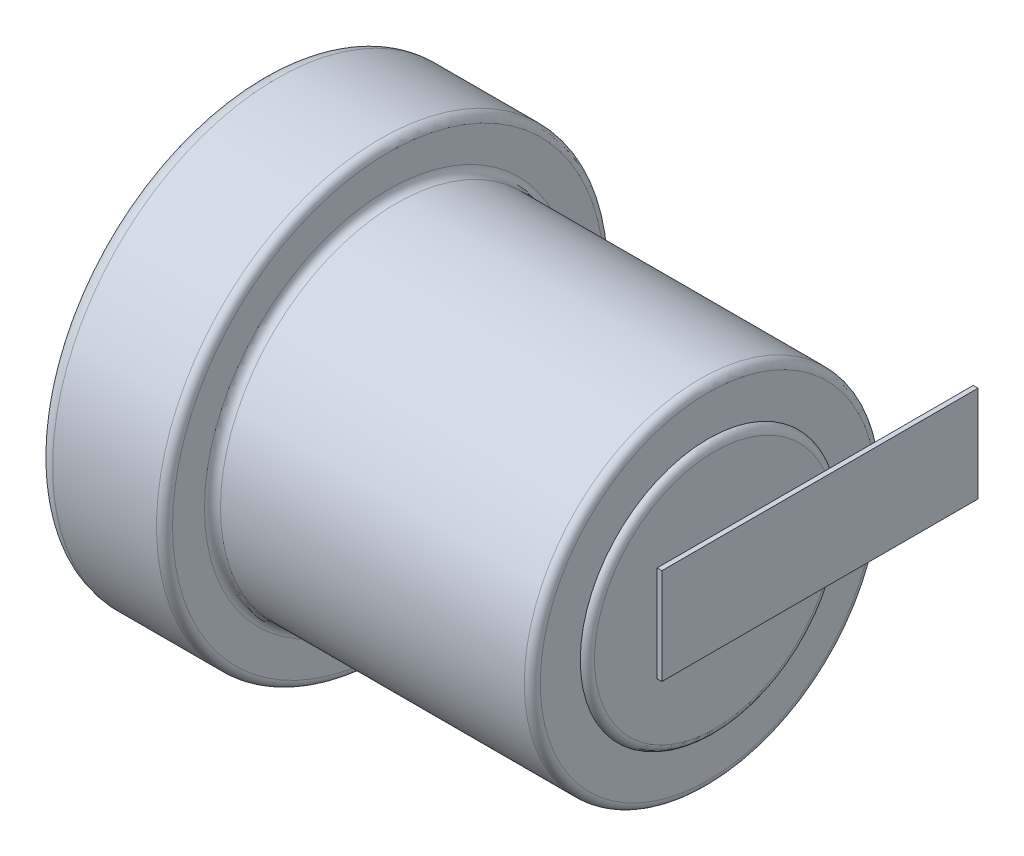
ISO-10303-21;
HEADER;
FILE_DESCRIPTION(('STEP AP214'),'2;1');
FILE_NAME('part.step','',(''),(''),'','','');
FILE_SCHEMA(('AUTOMOTIVE_DESIGN { 1 0 10303 214 1 1 1 1 }'));
ENDSEC;
DATA;
#1=APPLICATION_CONTEXT('core data for automotive mechanical design processes');
#2=APPLICATION_PROTOCOL_DEFINITION('international standard','automotive_design',2000,#1);
#3=PRODUCT_CONTEXT('',#1,'mechanical');
#4=PRODUCT('Part','Part','',(#3));
#5=PRODUCT_RELATED_PRODUCT_CATEGORY('part','',(#4));
#6=PRODUCT_DEFINITION_FORMATION('','',#4);
#7=PRODUCT_DEFINITION_CONTEXT('part definition',#1,'design');
#8=PRODUCT_DEFINITION('design','',#6,#7);
#9=PRODUCT_DEFINITION_SHAPE('','',#8);
#10=(LENGTH_UNIT() NAMED_UNIT(*) SI_UNIT(.MILLI.,.METRE.));
#11=(NAMED_UNIT(*) PLANE_ANGLE_UNIT() SI_UNIT($,.RADIAN.));
#12=(NAMED_UNIT(*) SI_UNIT($,.STERADIAN.) SOLID_ANGLE_UNIT());
#13=UNCERTAINTY_MEASURE_WITH_UNIT(LENGTH_MEASURE(1.E-05),#10,'distance_accuracy_value','');
#14=(GEOMETRIC_REPRESENTATION_CONTEXT(3) GLOBAL_UNCERTAINTY_ASSIGNED_CONTEXT((#13)) GLOBAL_UNIT_ASSIGNED_CONTEXT((#10,
#11,#12)) REPRESENTATION_CONTEXT('',''));
#15=CARTESIAN_POINT('',(0.,0.,0.));
#16=DIRECTION('',(0.,0.,1.));
#17=DIRECTION('',(1.,0.,0.));
#18=AXIS2_PLACEMENT_3D('',#15,#16,#17);
#19=CARTESIAN_POINT('',(14.2,0.,7.));
#20=DIRECTION('',(1.,0.,0.));
#21=DIRECTION('',(0.,0.,-1.));
#22=AXIS2_PLACEMENT_3D('',#19,#20,#21);
#23=PLANE('',#22);
#24=DIRECTION('',(0.,0.,-1.));
#25=VECTOR('',#24,1.);
#26=CARTESIAN_POINT('',(14.2,1.5,8.8));
#27=LINE('',#26,#25);
#28=CARTESIAN_POINT('',(14.2,1.5,8.8));
#29=VERTEX_POINT('',#28);
#30=CARTESIAN_POINT('',(14.2,1.5,3.55755781373551));
#31=VERTEX_POINT('',#30);
#32=EDGE_CURVE('E75',#29,#31,#27,.T.);
#33=ORIENTED_EDGE('',*,*,#32,.T.);
#34=CARTESIAN_POINT('',(14.2,0.,7.));
#35=DIRECTION('',(1.,0.,0.));
#36=DIRECTION('',(0.,0.,-1.));
#37=AXIS2_PLACEMENT_3D('',#34,#35,#36);
#38=CIRCLE('',#37,3.75505102572168);
#39=CARTESIAN_POINT('',(14.2,-1.5,3.55755781373551));
#40=VERTEX_POINT('',#39);
#41=EDGE_CURVE('E371',#31,#40,#38,.T.);
#42=ORIENTED_EDGE('',*,*,#41,.T.);
#43=DIRECTION('',(0.,0.,1.));
#44=VECTOR('',#43,1.);
#45=CARTESIAN_POINT('',(14.2,-1.5,7.));
#46=LINE('',#45,#44);
#47=CARTESIAN_POINT('',(14.2,-1.5,8.8));
#48=VERTEX_POINT('',#47);
#49=EDGE_CURVE('E67',#40,#48,#46,.T.);
#50=ORIENTED_EDGE('',*,*,#49,.T.);
#51=DIRECTION('',(0.,1.,0.));
#52=VECTOR('',#51,1.);
#53=CARTESIAN_POINT('',(14.2,-1.5,8.8));
#54=LINE('',#53,#52);
#55=EDGE_CURVE('E210',#48,#29,#54,.T.);
#56=ORIENTED_EDGE('',*,*,#55,.T.);
#57=EDGE_LOOP('',(#33,#42,#50,#56));
#58=FACE_BOUND('',#57,.T.);
#59=ADVANCED_FACE('F51',(#58),#23,.T.);
#60=CARTESIAN_POINT('',(-0.4,0.,7.));
#61=DIRECTION('',(-1.,0.,0.));
#62=DIRECTION('',(0.,0.,1.));
#63=AXIS2_PLACEMENT_3D('',#60,#61,#62);
#64=PLANE('',#63);
#65=CARTESIAN_POINT('',(-0.4,0.,7.));
#66=DIRECTION('',(-1.,0.,0.));
#67=DIRECTION('',(0.,0.,1.));
#68=AXIS2_PLACEMENT_3D('',#65,#66,#67);
#69=CIRCLE('',#68,3.);
#70=CARTESIAN_POINT('',(-0.4,0.,10.));
#71=VERTEX_POINT('',#70);
#72=EDGE_CURVE('E363',#71,#71,#69,.T.);
#73=ORIENTED_EDGE('',*,*,#72,.T.);
#74=EDGE_LOOP('',(#73));
#75=FACE_BOUND('',#74,.T.);
#76=DIRECTION('',(0.,1.,0.));
#77=VECTOR('',#76,1.);
#78=CARTESIAN_POINT('',(-0.4,-1.5,8.8));
#79=LINE('',#78,#77);
#80=CARTESIAN_POINT('',(-0.4,-1.5,8.8));
#81=VERTEX_POINT('',#80);
#82=CARTESIAN_POINT('',(-0.4,1.5,8.8));
#83=VERTEX_POINT('',#82);
#84=EDGE_CURVE('E307',#81,#83,#79,.T.);
#85=ORIENTED_EDGE('',*,*,#84,.F.);
#86=DIRECTION('',(0.,0.,1.));
#87=VECTOR('',#86,1.);
#88=CARTESIAN_POINT('',(-0.4,-1.5,7.));
#89=LINE('',#88,#87);
#90=CARTESIAN_POINT('',(-0.4,-1.5,5.2));
#91=VERTEX_POINT('',#90);
#92=EDGE_CURVE('E288',#91,#81,#89,.T.);
#93=ORIENTED_EDGE('',*,*,#92,.F.);
#94=DIRECTION('',(0.,-1.,0.));
#95=VECTOR('',#94,1.);
#96=CARTESIAN_POINT('',(-0.4,1.5,5.2));
#97=LINE('',#96,#95);
#98=CARTESIAN_POINT('',(-0.4,1.5,5.2));
#99=VERTEX_POINT('',#98);
#100=EDGE_CURVE('E293',#99,#91,#97,.T.);
#101=ORIENTED_EDGE('',*,*,#100,.F.);
#102=DIRECTION('',(0.,0.,-1.));
#103=VECTOR('',#102,1.);
#104=CARTESIAN_POINT('',(-0.4,1.5,8.8));
#105=LINE('',#104,#103);
#106=EDGE_CURVE('E310',#83,#99,#105,.T.);
#107=ORIENTED_EDGE('',*,*,#106,.F.);
#108=EDGE_LOOP('',(#85,#93,#101,#107));
#109=FACE_BOUND('',#108,.T.);
#110=ADVANCED_FACE('F395',(#75,#109),#64,.T.);
#111=CARTESIAN_POINT('',(4.,0.,7.));
#112=DIRECTION('',(-1.,0.,0.));
#113=DIRECTION('',(0.,0.,1.));
#114=AXIS2_PLACEMENT_3D('',#111,#112,#113);
#115=CYLINDRICAL_SURFACE('',#114,7.);
#116=CARTESIAN_POINT('',(0.5,0.,7.));
#117=DIRECTION('',(1.,0.,0.));
#118=DIRECTION('',(0.,0.,-1.));
#119=AXIS2_PLACEMENT_3D('',#116,#117,#118);
#120=CIRCLE('',#119,7.);
#121=CARTESIAN_POINT('',(0.5,0.,0.));
#122=VERTEX_POINT('',#121);
#123=EDGE_CURVE('E355',#122,#122,#120,.T.);
#124=ORIENTED_EDGE('',*,*,#123,.T.);
#125=EDGE_LOOP('',(#124));
#126=FACE_BOUND('',#125,.T.);
#127=CARTESIAN_POINT('',(3.75,0.,7.));
#128=DIRECTION('',(1.,0.,0.));
#129=DIRECTION('',(0.,0.,-1.));
#130=AXIS2_PLACEMENT_3D('',#127,#128,#129);
#131=CIRCLE('',#130,7.);
#132=CARTESIAN_POINT('',(3.75,0.,0.));
#133=VERTEX_POINT('',#132);
#134=EDGE_CURVE('E351',#133,#133,#131,.F.);
#135=ORIENTED_EDGE('',*,*,#134,.T.);
#136=EDGE_LOOP('',(#135));
#137=FACE_BOUND('',#136,.T.);
#138=ADVANCED_FACE('F400',(#126,#137),#115,.T.);
#139=CARTESIAN_POINT('',(4.,0.,0.));
#140=DIRECTION('',(1.,0.,0.));
#141=DIRECTION('',(0.,0.,-1.));
#142=AXIS2_PLACEMENT_3D('',#139,#140,#141);
#143=PLANE('',#142);
#144=CARTESIAN_POINT('',(4.,0.,7.));
#145=DIRECTION('',(1.,0.,0.));
#146=DIRECTION('',(0.,0.,-1.));
#147=AXIS2_PLACEMENT_3D('',#144,#145,#146);
#148=CIRCLE('',#147,6.75);
#149=CARTESIAN_POINT('',(4.,0.,0.25));
#150=VERTEX_POINT('',#149);
#151=EDGE_CURVE('E347',#150,#150,#148,.T.);
#152=ORIENTED_EDGE('',*,*,#151,.T.);
#153=EDGE_LOOP('',(#152));
#154=FACE_BOUND('',#153,.T.);
#155=CARTESIAN_POINT('',(4.,0.,7.));
#156=DIRECTION('',(1.,0.,0.));
#157=DIRECTION('',(0.,0.,-1.));
#158=AXIS2_PLACEMENT_3D('',#155,#156,#157);
#159=CIRCLE('',#158,5.75);
#160=CARTESIAN_POINT('',(4.,0.,1.25));
#161=VERTEX_POINT('',#160);
#162=EDGE_CURVE('E343',#161,#161,#159,.F.);
#163=ORIENTED_EDGE('',*,*,#162,.T.);
#164=EDGE_LOOP('',(#163));
#165=FACE_BOUND('',#164,.T.);
#166=ADVANCED_FACE('F414',(#154,#165),#143,.T.);
#167=CARTESIAN_POINT('',(0.,0.,0.));
#168=DIRECTION('',(1.,0.,0.));
#169=DIRECTION('',(0.,0.,-1.));
#170=AXIS2_PLACEMENT_3D('',#167,#168,#169);
#171=PLANE('',#170);
#172=CARTESIAN_POINT('',(0.,0.,7.));
#173=DIRECTION('',(1.,0.,0.));
#174=DIRECTION('',(0.,0.,-1.));
#175=AXIS2_PLACEMENT_3D('',#172,#173,#174);
#176=CIRCLE('',#175,6.5);
#177=CARTESIAN_POINT('',(0.,0.,0.5));
#178=VERTEX_POINT('',#177);
#179=EDGE_CURVE('E359',#178,#178,#176,.F.);
#180=ORIENTED_EDGE('',*,*,#179,.T.);
#181=EDGE_LOOP('',(#180));
#182=FACE_BOUND('',#181,.T.);
#183=CARTESIAN_POINT('',(0.,0.,7.));
#184=DIRECTION('',(-1.,0.,0.));
#185=DIRECTION('',(0.,0.,1.));
#186=AXIS2_PLACEMENT_3D('',#183,#184,#185);
#187=CIRCLE('',#186,5.);
#188=CARTESIAN_POINT('',(0.,0.,12.));
#189=VERTEX_POINT('',#188);
#190=EDGE_CURVE('E327',#189,#189,#187,.T.);
#191=ORIENTED_EDGE('',*,*,#190,.F.);
#192=EDGE_LOOP('',(#191));
#193=FACE_BOUND('',#192,.T.);
#194=ADVANCED_FACE('F412',(#182,#193),#171,.F.);
#195=CARTESIAN_POINT('',(14.,0.,7.));
#196=DIRECTION('',(-1.,0.,0.));
#197=DIRECTION('',(0.,0.,1.));
#198=AXIS2_PLACEMENT_3D('',#195,#196,#197);
#199=CYLINDRICAL_SURFACE('',#198,5.5);
#200=CARTESIAN_POINT('',(13.75,0.,7.));
#201=DIRECTION('',(1.,0.,0.));
#202=DIRECTION('',(0.,0.,-1.));
#203=AXIS2_PLACEMENT_3D('',#200,#201,#202);
#204=CIRCLE('',#203,5.5);
#205=CARTESIAN_POINT('',(13.75,0.,1.5));
#206=VERTEX_POINT('',#205);
#207=EDGE_CURVE('E12',#206,#206,#204,.F.);
#208=ORIENTED_EDGE('',*,*,#207,.T.);
#209=EDGE_LOOP('',(#208));
#210=FACE_BOUND('',#209,.T.);
#211=CARTESIAN_POINT('',(4.25,0.,7.));
#212=DIRECTION('',(1.,0.,0.));
#213=DIRECTION('',(0.,0.,-1.));
#214=AXIS2_PLACEMENT_3D('',#211,#212,#213);
#215=CIRCLE('',#214,5.5);
#216=CARTESIAN_POINT('',(4.25,0.,1.5));
#217=VERTEX_POINT('',#216);
#218=EDGE_CURVE('E339',#217,#217,#215,.T.);
#219=ORIENTED_EDGE('',*,*,#218,.T.);
#220=EDGE_LOOP('',(#219));
#221=FACE_BOUND('',#220,.T.);
#222=ADVANCED_FACE('F409',(#210,#221),#199,.T.);
#223=CARTESIAN_POINT('',(14.,0.,7.));
#224=DIRECTION('',(1.,0.,0.));
#225=DIRECTION('',(0.,0.,-1.));
#226=AXIS2_PLACEMENT_3D('',#223,#224,#225);
#227=PLANE('',#226);
#228=CARTESIAN_POINT('',(14.,0.,7.));
#229=DIRECTION('',(1.,0.,0.));
#230=DIRECTION('',(0.,0.,-1.));
#231=AXIS2_PLACEMENT_3D('',#228,#229,#230);
#232=CIRCLE('',#231,5.25);
#233=CARTESIAN_POINT('',(14.,0.,1.75));
#234=VERTEX_POINT('',#233);
#235=EDGE_CURVE('E60',#234,#234,#232,.T.);
#236=ORIENTED_EDGE('',*,*,#235,.T.);
#237=EDGE_LOOP('',(#236));
#238=FACE_BOUND('',#237,.T.);
#239=CARTESIAN_POINT('',(14.,0.,7.));
#240=DIRECTION('',(1.,0.,0.));
#241=DIRECTION('',(0.,0.,-1.));
#242=AXIS2_PLACEMENT_3D('',#239,#240,#241);
#243=CIRCLE('',#242,4.);
#244=CARTESIAN_POINT('',(14.,0.,3.));
#245=VERTEX_POINT('',#244);
#246=EDGE_CURVE('E332',#245,#245,#243,.T.);
#247=ORIENTED_EDGE('',*,*,#246,.F.);
#248=EDGE_LOOP('',(#247));
#249=FACE_BOUND('',#248,.T.);
#250=ADVANCED_FACE('F377',(#238,#249),#227,.T.);
#251=CARTESIAN_POINT('',(2.,0.,7.));
#252=DIRECTION('',(-1.,0.,0.));
#253=DIRECTION('',(0.,0.,1.));
#254=AXIS2_PLACEMENT_3D('',#251,#252,#253);
#255=CYLINDRICAL_SURFACE('',#254,5.);
#256=CARTESIAN_POINT('',(2.,0.,7.));
#257=DIRECTION('',(-1.,0.,0.));
#258=DIRECTION('',(0.,0.,1.));
#259=AXIS2_PLACEMENT_3D('',#256,#257,#258);
#260=CIRCLE('',#259,5.);
#261=CARTESIAN_POINT('',(2.,0.,12.));
#262=VERTEX_POINT('',#261);
#263=EDGE_CURVE('E328',#262,#262,#260,.T.);
#264=ORIENTED_EDGE('',*,*,#263,.F.);
#265=EDGE_LOOP('',(#264));
#266=FACE_BOUND('',#265,.T.);
#267=ORIENTED_EDGE('',*,*,#190,.T.);
#268=EDGE_LOOP('',(#267));
#269=FACE_BOUND('',#268,.T.);
#270=ADVANCED_FACE('F405',(#266,#269),#255,.F.);
#271=CARTESIAN_POINT('',(2.,0.,7.));
#272=DIRECTION('',(-1.,0.,0.));
#273=DIRECTION('',(0.,0.,1.));
#274=AXIS2_PLACEMENT_3D('',#271,#272,#273);
#275=PLANE('',#274);
#276=CARTESIAN_POINT('',(2.,0.,7.));
#277=DIRECTION('',(-1.,0.,0.));
#278=DIRECTION('',(0.,0.,1.));
#279=AXIS2_PLACEMENT_3D('',#276,#277,#278);
#280=CIRCLE('',#279,4.);
#281=CARTESIAN_POINT('',(2.,0.,11.));
#282=VERTEX_POINT('',#281);
#283=EDGE_CURVE('E323',#282,#282,#280,.T.);
#284=ORIENTED_EDGE('',*,*,#283,.F.);
#285=EDGE_LOOP('',(#284));
#286=FACE_BOUND('',#285,.T.);
#287=ORIENTED_EDGE('',*,*,#263,.T.);
#288=EDGE_LOOP('',(#287));
#289=FACE_BOUND('',#288,.T.);
#290=ADVANCED_FACE('F512',(#286,#289),#275,.T.);
#291=CARTESIAN_POINT('',(2.,0.,7.));
#292=DIRECTION('',(-1.,0.,0.));
#293=DIRECTION('',(0.,0.,1.));
#294=AXIS2_PLACEMENT_3D('',#291,#292,#293);
#295=CYLINDRICAL_SURFACE('',#294,4.);
#296=CARTESIAN_POINT('',(0.6,0.,7.));
#297=DIRECTION('',(-1.,0.,0.));
#298=DIRECTION('',(0.,0.,1.));
#299=AXIS2_PLACEMENT_3D('',#296,#297,#298);
#300=CIRCLE('',#299,4.);
#301=CARTESIAN_POINT('',(0.6,0.,11.));
#302=VERTEX_POINT('',#301);
#303=EDGE_CURVE('E367',#302,#302,#300,.F.);
#304=ORIENTED_EDGE('',*,*,#303,.T.);
#305=EDGE_LOOP('',(#304));
#306=FACE_BOUND('',#305,.T.);
#307=ORIENTED_EDGE('',*,*,#283,.T.);
#308=EDGE_LOOP('',(#307));
#309=FACE_BOUND('',#308,.T.);
#310=ADVANCED_FACE('F428',(#306,#309),#295,.T.);
#311=CARTESIAN_POINT('',(4.25,0.,7.));
#312=DIRECTION('',(1.,0.,0.));
#313=DIRECTION('',(0.,0.,-1.));
#314=AXIS2_PLACEMENT_3D('',#311,#312,#313);
#315=TOROIDAL_SURFACE('',#314,5.75,0.25);
#316=ORIENTED_EDGE('',*,*,#162,.F.);
#317=EDGE_LOOP('',(#316));
#318=FACE_BOUND('',#317,.T.);
#319=ORIENTED_EDGE('',*,*,#218,.F.);
#320=EDGE_LOOP('',(#319));
#321=FACE_BOUND('',#320,.T.);
#322=ADVANCED_FACE('F424',(#318,#321),#315,.F.);
#323=CARTESIAN_POINT('',(3.75,0.,7.));
#324=DIRECTION('',(1.,0.,0.));
#325=DIRECTION('',(0.,0.,-1.));
#326=AXIS2_PLACEMENT_3D('',#323,#324,#325);
#327=TOROIDAL_SURFACE('',#326,6.75,0.25);
#328=ORIENTED_EDGE('',*,*,#134,.F.);
#329=EDGE_LOOP('',(#328));
#330=FACE_BOUND('',#329,.T.);
#331=ORIENTED_EDGE('',*,*,#151,.F.);
#332=EDGE_LOOP('',(#331));
#333=FACE_BOUND('',#332,.T.);
#334=ADVANCED_FACE('F427',(#330,#333),#327,.T.);
#335=CARTESIAN_POINT('',(0.5,0.,7.));
#336=DIRECTION('',(1.,0.,0.));
#337=DIRECTION('',(0.,0.,-1.));
#338=AXIS2_PLACEMENT_3D('',#335,#336,#337);
#339=TOROIDAL_SURFACE('',#338,6.5,0.5);
#340=ORIENTED_EDGE('',*,*,#179,.F.);
#341=EDGE_LOOP('',(#340));
#342=FACE_BOUND('',#341,.T.);
#343=ORIENTED_EDGE('',*,*,#123,.F.);
#344=EDGE_LOOP('',(#343));
#345=FACE_BOUND('',#344,.T.);
#346=ADVANCED_FACE('F432',(#342,#345),#339,.T.);
#347=CARTESIAN_POINT('',(0.6,0.,7.));
#348=DIRECTION('',(-1.,0.,0.));
#349=DIRECTION('',(0.,0.,1.));
#350=AXIS2_PLACEMENT_3D('',#347,#348,#349);
#351=TOROIDAL_SURFACE('',#350,3.,1.);
#352=ORIENTED_EDGE('',*,*,#303,.F.);
#353=EDGE_LOOP('',(#352));
#354=FACE_BOUND('',#353,.T.);
#355=ORIENTED_EDGE('',*,*,#72,.F.);
#356=EDGE_LOOP('',(#355));
#357=FACE_BOUND('',#356,.T.);
#358=ADVANCED_FACE('F391',(#354,#357),#351,.T.);
#359=CARTESIAN_POINT('',(13.95,0.,7.));
#360=DIRECTION('',(-1.,0.,0.));
#361=DIRECTION('',(0.,0.,1.));
#362=AXIS2_PLACEMENT_3D('',#359,#360,#361);
#363=TOROIDAL_SURFACE('',#362,3.75505102572168,0.25);
#364=ORIENTED_EDGE('',*,*,#246,.T.);
#365=EDGE_LOOP('',(#364));
#366=FACE_BOUND('',#365,.T.);
#367=ORIENTED_EDGE('',*,*,#41,.F.);
#368=CARTESIAN_POINT('',(14.2,0.,7.));
#369=DIRECTION('',(-1.,0.,0.));
#370=DIRECTION('',(0.,0.,1.));
#371=AXIS2_PLACEMENT_3D('',#368,#369,#370);
#372=CIRCLE('',#371,3.75505102572168);
#373=EDGE_CURVE('E187',#40,#31,#372,.F.);
#374=ORIENTED_EDGE('',*,*,#373,.F.);
#375=EDGE_LOOP('',(#367,#374));
#376=FACE_BOUND('',#375,.T.);
#377=ADVANCED_FACE('F382',(#366,#376),#363,.T.);
#378=CARTESIAN_POINT('',(13.75,0.,7.));
#379=DIRECTION('',(1.,0.,0.));
#380=DIRECTION('',(0.,0.,-1.));
#381=AXIS2_PLACEMENT_3D('',#378,#379,#380);
#382=TOROIDAL_SURFACE('',#381,5.25,0.25);
#383=ORIENTED_EDGE('',*,*,#207,.F.);
#384=EDGE_LOOP('',(#383));
#385=FACE_BOUND('',#384,.T.);
#386=ORIENTED_EDGE('',*,*,#235,.F.);
#387=EDGE_LOOP('',(#386));
#388=FACE_BOUND('',#387,.T.);
#389=ADVANCED_FACE('F53',(#385,#388),#382,.T.);
#390=CARTESIAN_POINT('',(-0.55,-1.5,7.));
#391=DIRECTION('',(0.,1.,0.));
#392=DIRECTION('',(0.,0.,1.));
#393=AXIS2_PLACEMENT_3D('',#390,#391,#392);
#394=PLANE('',#393);
#395=ORIENTED_EDGE('',*,*,#92,.T.);
#396=DIRECTION('',(1.,0.,0.));
#397=VECTOR('',#396,1.);
#398=CARTESIAN_POINT('',(-0.55,-1.5,8.8));
#399=LINE('',#398,#397);
#400=CARTESIAN_POINT('',(-0.55,-1.5,8.8));
#401=VERTEX_POINT('',#400);
#402=EDGE_CURVE('E319',#401,#81,#399,.T.);
#403=ORIENTED_EDGE('',*,*,#402,.F.);
#404=DIRECTION('',(0.,0.,1.));
#405=VECTOR('',#404,1.);
#406=CARTESIAN_POINT('',(-0.55,-1.5,5.2));
#407=LINE('',#406,#405);
#408=CARTESIAN_POINT('',(-0.55,-1.5,5.2));
#409=VERTEX_POINT('',#408);
#410=EDGE_CURVE('E289',#409,#401,#407,.T.);
#411=ORIENTED_EDGE('',*,*,#410,.F.);
#412=DIRECTION('',(-0.707106781186548,0.,-0.707106781186548));
#413=VECTOR('',#412,1.);
#414=CARTESIAN_POINT('',(-0.55,-1.5,5.2));
#415=LINE('',#414,#413);
#416=CARTESIAN_POINT('',(-3.09558441227157,-1.5,2.65441558772843));
#417=VERTEX_POINT('',#416);
#418=EDGE_CURVE('E219',#409,#417,#415,.T.);
#419=ORIENTED_EDGE('',*,*,#418,.T.);
#420=DIRECTION('',(-0.389830749498263,0.,-0.920886522186975));
#421=VECTOR('',#420,1.);
#422=CARTESIAN_POINT('',(-3.15506798785565,-1.5,2.51389916331251));
#423=LINE('',#422,#421);
#424=CARTESIAN_POINT('',(-3.15506798785565,-1.5,2.51389916331251));
#425=VERTEX_POINT('',#424);
#426=EDGE_CURVE('E245',#417,#425,#423,.T.);
#427=ORIENTED_EDGE('',*,*,#426,.T.);
#428=DIRECTION('',(0.,0.,-1.));
#429=VECTOR('',#428,1.);
#430=CARTESIAN_POINT('',(-3.15506798785565,-1.5,-1.08610083668749));
#431=LINE('',#430,#429);
#432=CARTESIAN_POINT('',(-3.15506798785565,-1.5,-1.08610083668749));
#433=VERTEX_POINT('',#432);
#434=EDGE_CURVE('E249',#425,#433,#431,.T.);
#435=ORIENTED_EDGE('',*,*,#434,.T.);
#436=DIRECTION('',(1.,0.,0.));
#437=VECTOR('',#436,1.);
#438=CARTESIAN_POINT('',(-2.95506798785565,-1.5,-1.08610083668749));
#439=LINE('',#438,#437);
#440=CARTESIAN_POINT('',(-2.95506798785565,-1.5,-1.08610083668749));
#441=VERTEX_POINT('',#440);
#442=EDGE_CURVE('E253',#433,#441,#439,.T.);
#443=ORIENTED_EDGE('',*,*,#442,.T.);
#444=DIRECTION('',(0.,0.,1.));
#445=VECTOR('',#444,1.);
#446=CARTESIAN_POINT('',(-2.95506798785565,-1.5,2.51389916331251));
#447=LINE('',#446,#445);
#448=CARTESIAN_POINT('',(-2.95506798785565,-1.5,2.51389916331251));
#449=VERTEX_POINT('',#448);
#450=EDGE_CURVE('E257',#441,#449,#447,.T.);
#451=ORIENTED_EDGE('',*,*,#450,.T.);
#452=DIRECTION('',(0.707106781186547,0.,0.707106781186547));
#453=VECTOR('',#452,1.);
#454=CARTESIAN_POINT('',(-2.95506798785565,-1.5,2.51389916331251));
#455=LINE('',#454,#453);
#456=CARTESIAN_POINT('',(-0.409483575584084,-1.5,5.05948357558408));
#457=VERTEX_POINT('',#456);
#458=EDGE_CURVE('E261',#449,#457,#455,.T.);
#459=ORIENTED_EDGE('',*,*,#458,.T.);
#460=DIRECTION('',(0.0673376810305174,0.,0.997730242457064));
#461=VECTOR('',#460,1.);
#462=CARTESIAN_POINT('',(-0.4,-1.5,5.2));
#463=LINE('',#462,#461);
#464=EDGE_CURVE('E265',#457,#91,#463,.T.);
#465=ORIENTED_EDGE('',*,*,#464,.T.);
#466=EDGE_LOOP('',(#395,#403,#411,#419,#427,#435,#443,#451,#459,#465));
#467=FACE_BOUND('',#466,.T.);
#468=ADVANCED_FACE('F381',(#467),#394,.F.);
#469=CARTESIAN_POINT('',(-0.55,-1.5,8.8));
#470=DIRECTION('',(0.,0.,-1.));
#471=DIRECTION('',(-1.,0.,0.));
#472=AXIS2_PLACEMENT_3D('',#469,#470,#471);
#473=PLANE('',#472);
#474=ORIENTED_EDGE('',*,*,#84,.T.);
#475=DIRECTION('',(1.,0.,0.));
#476=VECTOR('',#475,1.);
#477=CARTESIAN_POINT('',(-0.55,1.5,8.8));
#478=LINE('',#477,#476);
#479=CARTESIAN_POINT('',(-0.55,1.5,8.8));
#480=VERTEX_POINT('',#479);
#481=EDGE_CURVE('E304',#480,#83,#478,.T.);
#482=ORIENTED_EDGE('',*,*,#481,.F.);
#483=DIRECTION('',(0.,1.,0.));
#484=VECTOR('',#483,1.);
#485=CARTESIAN_POINT('',(-0.55,-1.5,8.8));
#486=LINE('',#485,#484);
#487=EDGE_CURVE('E292',#401,#480,#486,.T.);
#488=ORIENTED_EDGE('',*,*,#487,.F.);
#489=ORIENTED_EDGE('',*,*,#402,.T.);
#490=EDGE_LOOP('',(#474,#482,#488,#489));
#491=FACE_BOUND('',#490,.T.);
#492=ADVANCED_FACE('F388',(#491),#473,.F.);
#493=CARTESIAN_POINT('',(-0.55,1.5,8.8));
#494=DIRECTION('',(0.,-1.,0.));
#495=DIRECTION('',(0.,0.,-1.));
#496=AXIS2_PLACEMENT_3D('',#493,#494,#495);
#497=PLANE('',#496);
#498=ORIENTED_EDGE('',*,*,#106,.T.);
#499=DIRECTION('',(-0.0673376810305174,0.,-0.997730242457064));
#500=VECTOR('',#499,1.);
#501=CARTESIAN_POINT('',(-0.4,1.5,5.2));
#502=LINE('',#501,#500);
#503=CARTESIAN_POINT('',(-0.409483575584085,1.5,5.05948357558408));
#504=VERTEX_POINT('',#503);
#505=EDGE_CURVE('E238',#99,#504,#502,.T.);
#506=ORIENTED_EDGE('',*,*,#505,.T.);
#507=DIRECTION('',(-0.707106781186547,0.,-0.707106781186548));
#508=VECTOR('',#507,1.);
#509=CARTESIAN_POINT('',(-2.95506798785565,1.5,2.51389916331251));
#510=LINE('',#509,#508);
#511=CARTESIAN_POINT('',(-2.95506798785565,1.5,2.51389916331251));
#512=VERTEX_POINT('',#511);
#513=EDGE_CURVE('E235',#504,#512,#510,.T.);
#514=ORIENTED_EDGE('',*,*,#513,.T.);
#515=DIRECTION('',(0.,0.,-1.));
#516=VECTOR('',#515,1.);
#517=CARTESIAN_POINT('',(-2.95506798785565,1.5,2.51389916331251));
#518=LINE('',#517,#516);
#519=CARTESIAN_POINT('',(-2.95506798785565,1.5,-1.08610083668749));
#520=VERTEX_POINT('',#519);
#521=EDGE_CURVE('E232',#512,#520,#518,.T.);
#522=ORIENTED_EDGE('',*,*,#521,.T.);
#523=DIRECTION('',(-1.,0.,0.));
#524=VECTOR('',#523,1.);
#525=CARTESIAN_POINT('',(-2.95506798785565,1.5,-1.08610083668749));
#526=LINE('',#525,#524);
#527=CARTESIAN_POINT('',(-3.15506798785565,1.5,-1.08610083668749));
#528=VERTEX_POINT('',#527);
#529=EDGE_CURVE('E229',#520,#528,#526,.T.);
#530=ORIENTED_EDGE('',*,*,#529,.T.);
#531=DIRECTION('',(0.,0.,1.));
#532=VECTOR('',#531,1.);
#533=CARTESIAN_POINT('',(-3.15506798785565,1.5,-1.08610083668749));
#534=LINE('',#533,#532);
#535=CARTESIAN_POINT('',(-3.15506798785565,1.5,2.51389916331251));
#536=VERTEX_POINT('',#535);
#537=EDGE_CURVE('E225',#528,#536,#534,.T.);
#538=ORIENTED_EDGE('',*,*,#537,.T.);
#539=DIRECTION('',(0.389830749498263,0.,0.920886522186976));
#540=VECTOR('',#539,1.);
#541=CARTESIAN_POINT('',(-3.15506798785565,1.5,2.51389916331251));
#542=LINE('',#541,#540);
#543=CARTESIAN_POINT('',(-3.09558441227157,1.5,2.65441558772843));
#544=VERTEX_POINT('',#543);
#545=EDGE_CURVE('E222',#536,#544,#542,.T.);
#546=ORIENTED_EDGE('',*,*,#545,.T.);
#547=DIRECTION('',(0.707106781186548,0.,0.707106781186548));
#548=VECTOR('',#547,1.);
#549=CARTESIAN_POINT('',(-0.55,1.5,5.2));
#550=LINE('',#549,#548);
#551=CARTESIAN_POINT('',(-0.55,1.5,5.2));
#552=VERTEX_POINT('',#551);
#553=EDGE_CURVE('E241',#544,#552,#550,.T.);
#554=ORIENTED_EDGE('',*,*,#553,.T.);
#555=DIRECTION('',(0.,0.,-1.));
#556=VECTOR('',#555,1.);
#557=CARTESIAN_POINT('',(-0.55,1.5,8.8));
#558=LINE('',#557,#556);
#559=EDGE_CURVE('E296',#480,#552,#558,.T.);
#560=ORIENTED_EDGE('',*,*,#559,.F.);
#561=ORIENTED_EDGE('',*,*,#481,.T.);
#562=EDGE_LOOP('',(#498,#506,#514,#522,#530,#538,#546,#554,#560,#561));
#563=FACE_BOUND('',#562,.T.);
#564=ADVANCED_FACE('F455',(#563),#497,.F.);
#565=CARTESIAN_POINT('',(-0.55,0.,0.));
#566=DIRECTION('',(-1.,0.,0.));
#567=DIRECTION('',(0.,0.,1.));
#568=AXIS2_PLACEMENT_3D('',#565,#566,#567);
#569=PLANE('',#568);
#570=ORIENTED_EDGE('',*,*,#410,.T.);
#571=ORIENTED_EDGE('',*,*,#487,.T.);
#572=ORIENTED_EDGE('',*,*,#559,.T.);
#573=DIRECTION('',(0.,-1.,0.));
#574=VECTOR('',#573,1.);
#575=CARTESIAN_POINT('',(-0.55,1.5,5.2));
#576=LINE('',#575,#574);
#577=EDGE_CURVE('E300',#552,#409,#576,.T.);
#578=ORIENTED_EDGE('',*,*,#577,.T.);
#579=EDGE_LOOP('',(#570,#571,#572,#578));
#580=FACE_BOUND('',#579,.T.);
#581=ADVANCED_FACE('F459',(#580),#569,.T.);
#582=CARTESIAN_POINT('',(-0.4,8.36334199546475,5.2));
#583=DIRECTION('',(0.997730242457064,0.,-0.0673376810305174));
#584=DIRECTION('',(-0.0673376810305174,0.,-0.997730242457064));
#585=AXIS2_PLACEMENT_3D('',#582,#583,#584);
#586=PLANE('',#585);
#587=ORIENTED_EDGE('',*,*,#505,.F.);
#588=ORIENTED_EDGE('',*,*,#100,.T.);
#589=ORIENTED_EDGE('',*,*,#464,.F.);
#590=DIRECTION('',(0.,-1.,0.));
#591=VECTOR('',#590,1.);
#592=CARTESIAN_POINT('',(-0.409483575584084,8.36334199546475,5.05948357558408));
#593=LINE('',#592,#591);
#594=EDGE_CURVE('E226',#504,#457,#593,.T.);
#595=ORIENTED_EDGE('',*,*,#594,.F.);
#596=EDGE_LOOP('',(#587,#588,#589,#595));
#597=FACE_BOUND('',#596,.T.);
#598=ADVANCED_FACE('F465',(#597),#586,.T.);
#599=CARTESIAN_POINT('',(-2.95506798785565,8.36334199546475,2.51389916331251));
#600=DIRECTION('',(0.707106781186548,0.,-0.707106781186547));
#601=DIRECTION('',(-0.707106781186547,0.,-0.707106781186548));
#602=AXIS2_PLACEMENT_3D('',#599,#600,#601);
#603=PLANE('',#602);
#604=ORIENTED_EDGE('',*,*,#513,.F.);
#605=ORIENTED_EDGE('',*,*,#594,.T.);
#606=ORIENTED_EDGE('',*,*,#458,.F.);
#607=DIRECTION('',(0.,-1.,0.));
#608=VECTOR('',#607,1.);
#609=CARTESIAN_POINT('',(-2.95506798785565,8.36334199546475,2.51389916331251));
#610=LINE('',#609,#608);
#611=EDGE_CURVE('E272',#512,#449,#610,.T.);
#612=ORIENTED_EDGE('',*,*,#611,.F.);
#613=EDGE_LOOP('',(#604,#605,#606,#612));
#614=FACE_BOUND('',#613,.T.);
#615=ADVANCED_FACE('F470',(#614),#603,.T.);
#616=CARTESIAN_POINT('',(-2.95506798785565,8.36334199546475,2.51389916331251));
#617=DIRECTION('',(1.,0.,0.));
#618=DIRECTION('',(0.,0.,-1.));
#619=AXIS2_PLACEMENT_3D('',#616,#617,#618);
#620=PLANE('',#619);
#621=ORIENTED_EDGE('',*,*,#521,.F.);
#622=ORIENTED_EDGE('',*,*,#611,.T.);
#623=ORIENTED_EDGE('',*,*,#450,.F.);
#624=DIRECTION('',(0.,-1.,0.));
#625=VECTOR('',#624,1.);
#626=CARTESIAN_POINT('',(-2.95506798785565,8.36334199546475,-1.08610083668749));
#627=LINE('',#626,#625);
#628=EDGE_CURVE('E275',#520,#441,#627,.T.);
#629=ORIENTED_EDGE('',*,*,#628,.F.);
#630=EDGE_LOOP('',(#621,#622,#623,#629));
#631=FACE_BOUND('',#630,.T.);
#632=ADVANCED_FACE('F473',(#631),#620,.T.);
#633=CARTESIAN_POINT('',(-2.95506798785565,8.36334199546475,-1.08610083668749));
#634=DIRECTION('',(0.,0.,-1.));
#635=DIRECTION('',(-1.,0.,0.));
#636=AXIS2_PLACEMENT_3D('',#633,#634,#635);
#637=PLANE('',#636);
#638=ORIENTED_EDGE('',*,*,#529,.F.);
#639=ORIENTED_EDGE('',*,*,#628,.T.);
#640=ORIENTED_EDGE('',*,*,#442,.F.);
#641=DIRECTION('',(0.,-1.,0.));
#642=VECTOR('',#641,1.);
#643=CARTESIAN_POINT('',(-3.15506798785565,8.36334199546475,-1.08610083668749));
#644=LINE('',#643,#642);
#645=EDGE_CURVE('E278',#528,#433,#644,.T.);
#646=ORIENTED_EDGE('',*,*,#645,.F.);
#647=EDGE_LOOP('',(#638,#639,#640,#646));
#648=FACE_BOUND('',#647,.T.);
#649=ADVANCED_FACE('F479',(#648),#637,.T.);
#650=CARTESIAN_POINT('',(-3.15506798785565,8.36334199546475,-1.08610083668749));
#651=DIRECTION('',(-1.,0.,0.));
#652=DIRECTION('',(0.,0.,1.));
#653=AXIS2_PLACEMENT_3D('',#650,#651,#652);
#654=PLANE('',#653);
#655=ORIENTED_EDGE('',*,*,#537,.F.);
#656=ORIENTED_EDGE('',*,*,#645,.T.);
#657=ORIENTED_EDGE('',*,*,#434,.F.);
#658=DIRECTION('',(0.,-1.,0.));
#659=VECTOR('',#658,1.);
#660=CARTESIAN_POINT('',(-3.15506798785565,8.36334199546475,2.51389916331251));
#661=LINE('',#660,#659);
#662=EDGE_CURVE('E281',#536,#425,#661,.T.);
#663=ORIENTED_EDGE('',*,*,#662,.F.);
#664=EDGE_LOOP('',(#655,#656,#657,#663));
#665=FACE_BOUND('',#664,.T.);
#666=ADVANCED_FACE('F483',(#665),#654,.T.);
#667=CARTESIAN_POINT('',(-3.15506798785565,8.36334199546475,2.51389916331251));
#668=DIRECTION('',(-0.920886522186975,0.,0.389830749498263));
#669=DIRECTION('',(0.389830749498263,0.,0.920886522186976));
#670=AXIS2_PLACEMENT_3D('',#667,#668,#669);
#671=PLANE('',#670);
#672=ORIENTED_EDGE('',*,*,#545,.F.);
#673=ORIENTED_EDGE('',*,*,#662,.T.);
#674=ORIENTED_EDGE('',*,*,#426,.F.);
#675=DIRECTION('',(0.,-1.,0.));
#676=VECTOR('',#675,1.);
#677=CARTESIAN_POINT('',(-3.09558441227157,8.36334199546475,2.65441558772843));
#678=LINE('',#677,#676);
#679=EDGE_CURVE('E269',#544,#417,#678,.T.);
#680=ORIENTED_EDGE('',*,*,#679,.F.);
#681=EDGE_LOOP('',(#672,#673,#674,#680));
#682=FACE_BOUND('',#681,.T.);
#683=ADVANCED_FACE('F488',(#682),#671,.T.);
#684=CARTESIAN_POINT('',(-0.55,8.36334199546475,5.2));
#685=DIRECTION('',(-0.707106781186548,0.,0.707106781186548));
#686=DIRECTION('',(0.707106781186548,0.,0.707106781186548));
#687=AXIS2_PLACEMENT_3D('',#684,#685,#686);
#688=PLANE('',#687);
#689=ORIENTED_EDGE('',*,*,#553,.F.);
#690=ORIENTED_EDGE('',*,*,#679,.T.);
#691=ORIENTED_EDGE('',*,*,#418,.F.);
#692=ORIENTED_EDGE('',*,*,#577,.F.);
#693=EDGE_LOOP('',(#689,#690,#691,#692));
#694=FACE_BOUND('',#693,.T.);
#695=ADVANCED_FACE('F491',(#694),#688,.T.);
#696=CARTESIAN_POINT('',(14.35,1.5,8.8));
#697=DIRECTION('',(0.,1.,0.));
#698=DIRECTION('',(0.,0.,1.));
#699=AXIS2_PLACEMENT_3D('',#696,#697,#698);
#700=PLANE('',#699);
#701=ORIENTED_EDGE('',*,*,#32,.F.);
#702=DIRECTION('',(-1.,0.,0.));
#703=VECTOR('',#702,1.);
#704=CARTESIAN_POINT('',(14.35,1.5,8.8));
#705=LINE('',#704,#703);
#706=CARTESIAN_POINT('',(14.35,1.5,8.8));
#707=VERTEX_POINT('',#706);
#708=EDGE_CURVE('E215',#707,#29,#705,.T.);
#709=ORIENTED_EDGE('',*,*,#708,.F.);
#710=DIRECTION('',(0.,0.,-1.));
#711=VECTOR('',#710,1.);
#712=CARTESIAN_POINT('',(14.35,1.5,8.8));
#713=LINE('',#712,#711);
#714=CARTESIAN_POINT('',(14.35,1.5,-1.08610083668749));
#715=VERTEX_POINT('',#714);
#716=EDGE_CURVE('E204',#707,#715,#713,.T.);
#717=ORIENTED_EDGE('',*,*,#716,.T.);
#718=DIRECTION('',(1.,0.,0.));
#719=VECTOR('',#718,1.);
#720=CARTESIAN_POINT('',(14.2,1.5,-1.08610083668749));
#721=LINE('',#720,#719);
#722=CARTESIAN_POINT('',(14.2,1.5,-1.08610083668749));
#723=VERTEX_POINT('',#722);
#724=EDGE_CURVE('E185',#723,#715,#721,.T.);
#725=ORIENTED_EDGE('',*,*,#724,.F.);
#726=DIRECTION('',(0.,0.,1.));
#727=VECTOR('',#726,1.);
#728=CARTESIAN_POINT('',(14.2,1.5,-4.08984849586261));
#729=LINE('',#728,#727);
#730=EDGE_CURVE('E182',#723,#31,#729,.T.);
#731=ORIENTED_EDGE('',*,*,#730,.T.);
#732=EDGE_LOOP('',(#701,#709,#717,#725,#731));
#733=FACE_BOUND('',#732,.T.);
#734=ADVANCED_FACE('F493',(#733),#700,.T.);
#735=CARTESIAN_POINT('',(14.35,-1.5,8.8));
#736=DIRECTION('',(0.,0.,1.));
#737=DIRECTION('',(1.,0.,0.));
#738=AXIS2_PLACEMENT_3D('',#735,#736,#737);
#739=PLANE('',#738);
#740=ORIENTED_EDGE('',*,*,#55,.F.);
#741=DIRECTION('',(-1.,0.,0.));
#742=VECTOR('',#741,1.);
#743=CARTESIAN_POINT('',(14.35,-1.5,8.8));
#744=LINE('',#743,#742);
#745=CARTESIAN_POINT('',(14.35,-1.5,8.8));
#746=VERTEX_POINT('',#745);
#747=EDGE_CURVE('E207',#746,#48,#744,.T.);
#748=ORIENTED_EDGE('',*,*,#747,.F.);
#749=DIRECTION('',(0.,1.,0.));
#750=VECTOR('',#749,1.);
#751=CARTESIAN_POINT('',(14.35,-1.5,8.8));
#752=LINE('',#751,#750);
#753=EDGE_CURVE('E168',#746,#707,#752,.T.);
#754=ORIENTED_EDGE('',*,*,#753,.T.);
#755=ORIENTED_EDGE('',*,*,#708,.T.);
#756=EDGE_LOOP('',(#740,#748,#754,#755));
#757=FACE_BOUND('',#756,.T.);
#758=ADVANCED_FACE('F499',(#757),#739,.T.);
#759=CARTESIAN_POINT('',(14.35,-1.5,7.));
#760=DIRECTION('',(0.,-1.,0.));
#761=DIRECTION('',(0.,0.,-1.));
#762=AXIS2_PLACEMENT_3D('',#759,#760,#761);
#763=PLANE('',#762);
#764=ORIENTED_EDGE('',*,*,#49,.F.);
#765=DIRECTION('',(0.,0.,1.));
#766=VECTOR('',#765,1.);
#767=CARTESIAN_POINT('',(14.2,-1.5,-4.08984849586261));
#768=LINE('',#767,#766);
#769=CARTESIAN_POINT('',(14.2,-1.5,-1.08610083668749));
#770=VERTEX_POINT('',#769);
#771=EDGE_CURVE('E176',#770,#40,#768,.T.);
#772=ORIENTED_EDGE('',*,*,#771,.F.);
#773=DIRECTION('',(-1.,0.,0.));
#774=VECTOR('',#773,1.);
#775=CARTESIAN_POINT('',(14.2,-1.5,-1.08610083668749));
#776=LINE('',#775,#774);
#777=CARTESIAN_POINT('',(14.35,-1.5,-1.08610083668749));
#778=VERTEX_POINT('',#777);
#779=EDGE_CURVE('E173',#778,#770,#776,.T.);
#780=ORIENTED_EDGE('',*,*,#779,.F.);
#781=DIRECTION('',(0.,0.,1.));
#782=VECTOR('',#781,1.);
#783=CARTESIAN_POINT('',(14.35,-1.5,5.2));
#784=LINE('',#783,#782);
#785=EDGE_CURVE('E160',#778,#746,#784,.T.);
#786=ORIENTED_EDGE('',*,*,#785,.T.);
#787=ORIENTED_EDGE('',*,*,#747,.T.);
#788=EDGE_LOOP('',(#764,#772,#780,#786,#787));
#789=FACE_BOUND('',#788,.T.);
#790=ADVANCED_FACE('F174',(#789),#763,.T.);
#791=CARTESIAN_POINT('',(14.35,0.,0.));
#792=DIRECTION('',(-1.,0.,0.));
#793=DIRECTION('',(0.,0.,1.));
#794=AXIS2_PLACEMENT_3D('',#791,#792,#793);
#795=PLANE('',#794);
#796=ORIENTED_EDGE('',*,*,#785,.F.);
#797=DIRECTION('',(0.,-1.,0.));
#798=VECTOR('',#797,1.);
#799=CARTESIAN_POINT('',(14.35,1.5,-1.08610083668749));
#800=LINE('',#799,#798);
#801=EDGE_CURVE('E165',#715,#778,#800,.T.);
#802=ORIENTED_EDGE('',*,*,#801,.F.);
#803=ORIENTED_EDGE('',*,*,#716,.F.);
#804=ORIENTED_EDGE('',*,*,#753,.F.);
#805=EDGE_LOOP('',(#796,#802,#803,#804));
#806=FACE_BOUND('',#805,.T.);
#807=ADVANCED_FACE('F162',(#806),#795,.F.);
#808=CARTESIAN_POINT('',(14.2,1.5,-4.08984849586261));
#809=DIRECTION('',(1.,0.,0.));
#810=DIRECTION('',(0.,0.,-1.));
#811=AXIS2_PLACEMENT_3D('',#808,#809,#810);
#812=PLANE('',#811);
#813=ORIENTED_EDGE('',*,*,#771,.T.);
#814=ORIENTED_EDGE('',*,*,#373,.T.);
#815=ORIENTED_EDGE('',*,*,#730,.F.);
#816=DIRECTION('',(0.,1.,0.));
#817=VECTOR('',#816,1.);
#818=CARTESIAN_POINT('',(14.2,1.5,-1.08610083668749));
#819=LINE('',#818,#817);
#820=EDGE_CURVE('E181',#770,#723,#819,.T.);
#821=ORIENTED_EDGE('',*,*,#820,.F.);
#822=EDGE_LOOP('',(#813,#814,#815,#821));
#823=FACE_BOUND('',#822,.T.);
#824=ADVANCED_FACE('F689',(#823),#812,.F.);
#825=CARTESIAN_POINT('',(-2.95506798785565,8.36334199546475,-1.08610083668749));
#826=DIRECTION('',(0.,0.,-1.));
#827=DIRECTION('',(-1.,0.,0.));
#828=AXIS2_PLACEMENT_3D('',#825,#826,#827);
#829=PLANE('',#828);
#830=ORIENTED_EDGE('',*,*,#779,.T.);
#831=ORIENTED_EDGE('',*,*,#820,.T.);
#832=ORIENTED_EDGE('',*,*,#724,.T.);
#833=ORIENTED_EDGE('',*,*,#801,.T.);
#834=EDGE_LOOP('',(#830,#831,#832,#833));
#835=FACE_BOUND('',#834,.T.);
#836=ADVANCED_FACE('F184',(#835),#829,.T.);
#837=CLOSED_SHELL('',(#59,#110,#138,#166,#194,#222,#250,#270,#290,#310,#322,#334,#346,#358,#377,
#389,#468,#492,#564,#581,#598,#615,#632,#649,#666,#683,#695,#734,#758,#790,#807,#824,#836));
#838=MANIFOLD_SOLID_BREP('B2',#837);
#839=ADVANCED_BREP_SHAPE_REPRESENTATION('',(#18,#838),#14);
#840=SHAPE_DEFINITION_REPRESENTATION(#9,#839);
ENDSEC;
END-ISO-10303-21;
